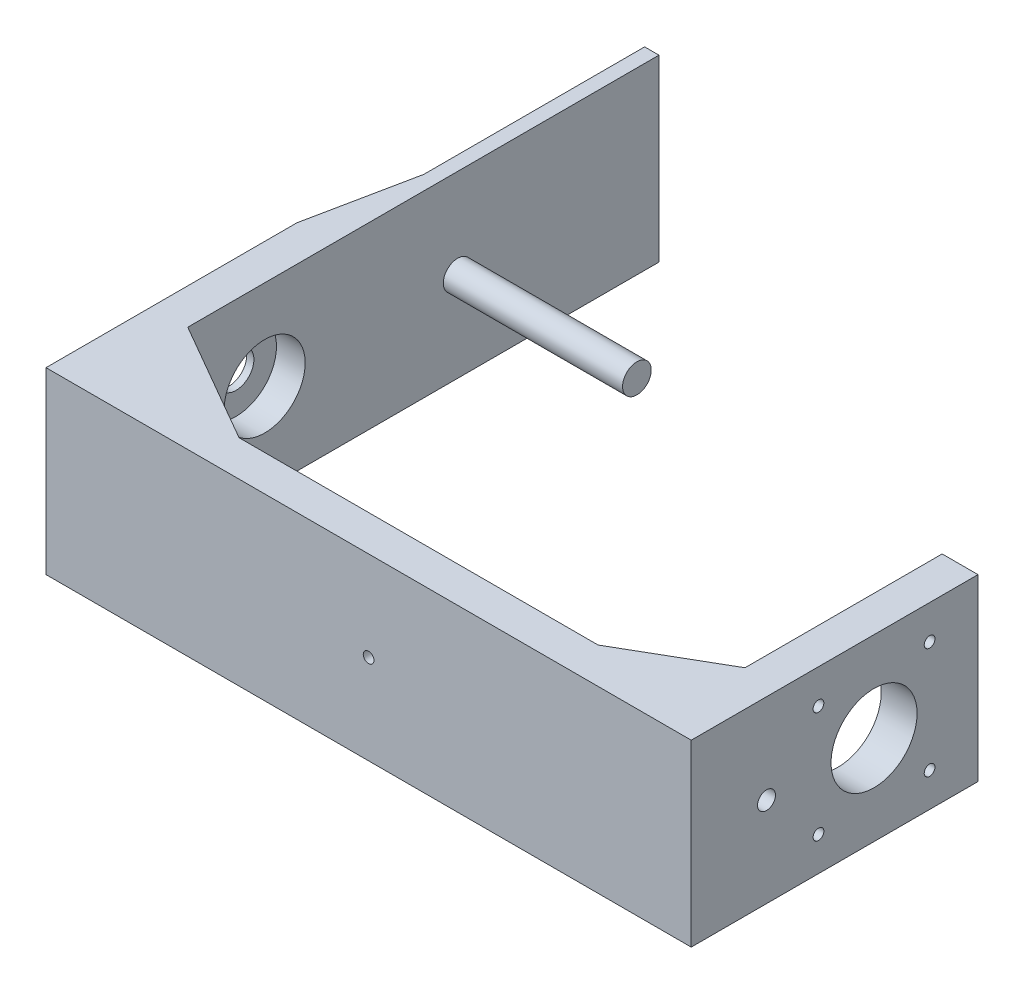
ISO-10303-21;
HEADER;
FILE_DESCRIPTION(('STEP AP214'),'2;1');
FILE_NAME('part.step','',(''),(''),'','','');
FILE_SCHEMA(('AUTOMOTIVE_DESIGN { 1 0 10303 214 1 1 1 1 }'));
ENDSEC;
DATA;
#1=APPLICATION_CONTEXT('core data for automotive mechanical design processes');
#2=APPLICATION_PROTOCOL_DEFINITION('international standard','automotive_design',2000,#1);
#3=PRODUCT_CONTEXT('',#1,'mechanical');
#4=PRODUCT('Part','Part','',(#3));
#5=PRODUCT_RELATED_PRODUCT_CATEGORY('part','',(#4));
#6=PRODUCT_DEFINITION_FORMATION('','',#4);
#7=PRODUCT_DEFINITION_CONTEXT('part definition',#1,'design');
#8=PRODUCT_DEFINITION('design','',#6,#7);
#9=PRODUCT_DEFINITION_SHAPE('','',#8);
#10=(LENGTH_UNIT() NAMED_UNIT(*) SI_UNIT(.MILLI.,.METRE.));
#11=(NAMED_UNIT(*) PLANE_ANGLE_UNIT() SI_UNIT($,.RADIAN.));
#12=(NAMED_UNIT(*) SI_UNIT($,.STERADIAN.) SOLID_ANGLE_UNIT());
#13=UNCERTAINTY_MEASURE_WITH_UNIT(LENGTH_MEASURE(1.E-05),#10,'distance_accuracy_value','');
#14=(GEOMETRIC_REPRESENTATION_CONTEXT(3) GLOBAL_UNCERTAINTY_ASSIGNED_CONTEXT((#13)) GLOBAL_UNIT_ASSIGNED_CONTEXT((#10,
#11,#12)) REPRESENTATION_CONTEXT('',''));
#15=CARTESIAN_POINT('',(0.,0.,0.));
#16=DIRECTION('',(0.,0.,1.));
#17=DIRECTION('',(1.,0.,0.));
#18=AXIS2_PLACEMENT_3D('',#15,#16,#17);
#19=CARTESIAN_POINT('',(-87.9400428265525,50.,-151.));
#20=DIRECTION('',(1.,0.,0.));
#21=DIRECTION('',(0.,0.,-1.));
#22=AXIS2_PLACEMENT_3D('',#19,#20,#21);
#23=PLANE('',#22);
#24=DIRECTION('',(0.,1.,0.));
#25=VECTOR('',#24,1.);
#26=CARTESIAN_POINT('',(-87.9400428265525,0.,-89.393876913398));
#27=LINE('',#26,#25);
#28=CARTESIAN_POINT('',(-87.9400428265525,0.,-89.393876913398));
#29=VERTEX_POINT('',#28);
#30=CARTESIAN_POINT('',(-87.9400428265525,50.,-89.393876913398));
#31=VERTEX_POINT('',#30);
#32=EDGE_CURVE('E171',#29,#31,#27,.T.);
#33=ORIENTED_EDGE('',*,*,#32,.T.);
#34=DIRECTION('',(0.,0.,1.));
#35=VECTOR('',#34,1.);
#36=CARTESIAN_POINT('',(-87.9400428265525,50.,-151.));
#37=LINE('',#36,#35);
#38=CARTESIAN_POINT('',(-87.9400428265525,50.,-151.));
#39=VERTEX_POINT('',#38);
#40=EDGE_CURVE('E364',#39,#31,#37,.T.);
#41=ORIENTED_EDGE('',*,*,#40,.F.);
#42=DIRECTION('',(0.,1.,0.));
#43=VECTOR('',#42,1.);
#44=CARTESIAN_POINT('',(-87.9400428265525,50.,-151.));
#45=LINE('',#44,#43);
#46=CARTESIAN_POINT('',(-87.9400428265525,0.,-151.));
#47=VERTEX_POINT('',#46);
#48=EDGE_CURVE('E362',#47,#39,#45,.T.);
#49=ORIENTED_EDGE('',*,*,#48,.F.);
#50=DIRECTION('',(0.,0.,1.));
#51=VECTOR('',#50,1.);
#52=CARTESIAN_POINT('',(-87.9400428265525,0.,-151.));
#53=LINE('',#52,#51);
#54=EDGE_CURVE('E366',#47,#29,#53,.T.);
#55=ORIENTED_EDGE('',*,*,#54,.T.);
#56=EDGE_LOOP('',(#33,#41,#49,#55));
#57=FACE_BOUND('',#56,.T.);
#58=ADVANCED_FACE('F39',(#57),#23,.F.);
#59=CARTESIAN_POINT('',(-83.9400428265525,50.,0.));
#60=DIRECTION('',(-1.,0.,0.));
#61=DIRECTION('',(0.,0.,1.));
#62=AXIS2_PLACEMENT_3D('',#59,#60,#61);
#63=PLANE('',#62);
#64=CARTESIAN_POINT('',(-83.9400428265525,25.,-94.8407118438723));
#65=DIRECTION('',(-1.,0.,0.));
#66=DIRECTION('',(0.,0.,1.));
#67=AXIS2_PLACEMENT_3D('',#64,#65,#66);
#68=CIRCLE('',#67,4.00466646244737);
#69=CARTESIAN_POINT('',(-83.9400428265525,25.,-90.836045381425));
#70=VERTEX_POINT('',#69);
#71=EDGE_CURVE('E11',#70,#70,#68,.F.);
#72=ORIENTED_EDGE('',*,*,#71,.F.);
#73=EDGE_LOOP('',(#72));
#74=FACE_BOUND('',#73,.T.);
#75=CARTESIAN_POINT('',(-83.9400428265525,25.,-41.));
#76=DIRECTION('',(1.,0.,0.));
#77=DIRECTION('',(0.,0.,-1.));
#78=AXIS2_PLACEMENT_3D('',#75,#76,#77);
#79=CIRCLE('',#78,11.3);
#80=CARTESIAN_POINT('',(-83.9400428265525,25.,-52.3));
#81=VERTEX_POINT('',#80);
#82=EDGE_CURVE('E245',#81,#81,#79,.T.);
#83=ORIENTED_EDGE('',*,*,#82,.F.);
#84=EDGE_LOOP('',(#83));
#85=FACE_BOUND('',#84,.T.);
#86=CARTESIAN_POINT('',(-83.9400428265525,25.,-11.));
#87=DIRECTION('',(1.,0.,0.));
#88=DIRECTION('',(0.,0.,-1.));
#89=AXIS2_PLACEMENT_3D('',#86,#87,#88);
#90=CIRCLE('',#89,2.5);
#91=CARTESIAN_POINT('',(-83.9400428265525,25.,-13.5));
#92=VERTEX_POINT('',#91);
#93=EDGE_CURVE('E377',#92,#92,#90,.T.);
#94=ORIENTED_EDGE('',*,*,#93,.F.);
#95=EDGE_LOOP('',(#94));
#96=FACE_BOUND('',#95,.T.);
#97=DIRECTION('',(0.,0.,1.));
#98=VECTOR('',#97,1.);
#99=CARTESIAN_POINT('',(-83.9400428265525,6.,0.));
#100=LINE('',#99,#98);
#101=CARTESIAN_POINT('',(-83.9400428265525,6.,-19.5495695730572));
#102=VERTEX_POINT('',#101);
#103=CARTESIAN_POINT('',(-83.9400428265525,6.,0.));
#104=VERTEX_POINT('',#103);
#105=EDGE_CURVE('E54',#102,#104,#100,.T.);
#106=ORIENTED_EDGE('',*,*,#105,.F.);
#107=DIRECTION('',(0.,1.,0.));
#108=VECTOR('',#107,1.);
#109=CARTESIAN_POINT('',(-83.9400428265525,50.,-19.5495695730572));
#110=LINE('',#109,#108);
#111=CARTESIAN_POINT('',(-83.9400428265525,0.,-19.5495695730572));
#112=VERTEX_POINT('',#111);
#113=EDGE_CURVE('E239',#102,#112,#110,.F.);
#114=ORIENTED_EDGE('',*,*,#113,.T.);
#115=DIRECTION('',(0.,0.,-1.));
#116=VECTOR('',#115,1.);
#117=CARTESIAN_POINT('',(-83.9400428265525,0.,0.));
#118=LINE('',#117,#116);
#119=CARTESIAN_POINT('',(-83.9400428265525,0.,-151.));
#120=VERTEX_POINT('',#119);
#121=EDGE_CURVE('E192',#112,#120,#118,.T.);
#122=ORIENTED_EDGE('',*,*,#121,.T.);
#123=DIRECTION('',(0.,-1.,0.));
#124=VECTOR('',#123,1.);
#125=CARTESIAN_POINT('',(-83.9400428265525,50.,-151.));
#126=LINE('',#125,#124);
#127=CARTESIAN_POINT('',(-83.9400428265525,50.,-151.));
#128=VERTEX_POINT('',#127);
#129=EDGE_CURVE('E354',#128,#120,#126,.T.);
#130=ORIENTED_EDGE('',*,*,#129,.F.);
#131=DIRECTION('',(0.,0.,-1.));
#132=VECTOR('',#131,1.);
#133=CARTESIAN_POINT('',(-83.9400428265525,50.,0.));
#134=LINE('',#133,#132);
#135=CARTESIAN_POINT('',(-83.9400428265525,50.,-19.5495695730572));
#136=VERTEX_POINT('',#135);
#137=EDGE_CURVE('E207',#136,#128,#134,.T.);
#138=ORIENTED_EDGE('',*,*,#137,.F.);
#139=DIRECTION('',(0.,-1.,0.));
#140=VECTOR('',#139,1.);
#141=CARTESIAN_POINT('',(-83.9400428265525,50.,-19.5495695730572));
#142=LINE('',#141,#140);
#143=CARTESIAN_POINT('',(-83.9400428265525,44.,-19.5495695730572));
#144=VERTEX_POINT('',#143);
#145=EDGE_CURVE('E260',#136,#144,#142,.T.);
#146=ORIENTED_EDGE('',*,*,#145,.T.);
#147=DIRECTION('',(0.,0.,-1.));
#148=VECTOR('',#147,1.);
#149=CARTESIAN_POINT('',(-83.9400428265525,44.,0.));
#150=LINE('',#149,#148);
#151=CARTESIAN_POINT('',(-83.9400428265525,44.,0.));
#152=VERTEX_POINT('',#151);
#153=EDGE_CURVE('E263',#152,#144,#150,.T.);
#154=ORIENTED_EDGE('',*,*,#153,.F.);
#155=DIRECTION('',(0.,-1.,0.));
#156=VECTOR('',#155,1.);
#157=CARTESIAN_POINT('',(-83.9400428265525,50.,0.));
#158=LINE('',#157,#156);
#159=EDGE_CURVE('E208',#152,#104,#158,.T.);
#160=ORIENTED_EDGE('',*,*,#159,.T.);
#161=EDGE_LOOP('',(#106,#114,#122,#130,#138,#146,#154,#160));
#162=FACE_BOUND('',#161,.T.);
#163=ADVANCED_FACE('F41',(#74,#85,#96,#162),#63,.F.);
#164=CARTESIAN_POINT('',(-93.9400428265525,50.,10.));
#165=DIRECTION('',(1.,0.,0.));
#166=DIRECTION('',(0.,0.,-1.));
#167=AXIS2_PLACEMENT_3D('',#164,#165,#166);
#168=PLANE('',#167);
#169=CARTESIAN_POINT('',(-93.9400428265525,25.,-41.));
#170=DIRECTION('',(-1.,0.,0.));
#171=DIRECTION('',(0.,0.,1.));
#172=AXIS2_PLACEMENT_3D('',#169,#170,#171);
#173=CIRCLE('',#172,5.);
#174=CARTESIAN_POINT('',(-93.9400428265525,25.,-36.));
#175=VERTEX_POINT('',#174);
#176=EDGE_CURVE('E378',#175,#175,#173,.T.);
#177=ORIENTED_EDGE('',*,*,#176,.F.);
#178=EDGE_LOOP('',(#177));
#179=FACE_BOUND('',#178,.T.);
#180=CARTESIAN_POINT('',(-93.9400428265525,25.,-11.));
#181=DIRECTION('',(-1.,0.,0.));
#182=DIRECTION('',(0.,0.,1.));
#183=AXIS2_PLACEMENT_3D('',#180,#181,#182);
#184=CIRCLE('',#183,0.75);
#185=CARTESIAN_POINT('',(-93.9400428265525,25.,-10.25));
#186=VERTEX_POINT('',#185);
#187=EDGE_CURVE('E373',#186,#186,#184,.T.);
#188=ORIENTED_EDGE('',*,*,#187,.F.);
#189=EDGE_LOOP('',(#188));
#190=FACE_BOUND('',#189,.T.);
#191=DIRECTION('',(0.,0.,1.));
#192=VECTOR('',#191,1.);
#193=CARTESIAN_POINT('',(-93.9400428265525,0.,10.));
#194=LINE('',#193,#192);
#195=CARTESIAN_POINT('',(-93.9400428265525,0.,-60.));
#196=VERTEX_POINT('',#195);
#197=CARTESIAN_POINT('',(-93.9400428265525,0.,10.));
#198=VERTEX_POINT('',#197);
#199=EDGE_CURVE('E183',#196,#198,#194,.T.);
#200=ORIENTED_EDGE('',*,*,#199,.T.);
#201=DIRECTION('',(0.,-1.,0.));
#202=VECTOR('',#201,1.);
#203=CARTESIAN_POINT('',(-93.9400428265525,50.,10.));
#204=LINE('',#203,#202);
#205=CARTESIAN_POINT('',(-93.9400428265525,50.,10.));
#206=VERTEX_POINT('',#205);
#207=EDGE_CURVE('E187',#206,#198,#204,.T.);
#208=ORIENTED_EDGE('',*,*,#207,.F.);
#209=DIRECTION('',(0.,0.,1.));
#210=VECTOR('',#209,1.);
#211=CARTESIAN_POINT('',(-93.9400428265525,50.,10.));
#212=LINE('',#211,#210);
#213=CARTESIAN_POINT('',(-93.9400428265525,50.,-60.));
#214=VERTEX_POINT('',#213);
#215=EDGE_CURVE('E185',#214,#206,#212,.T.);
#216=ORIENTED_EDGE('',*,*,#215,.F.);
#217=DIRECTION('',(0.,-1.,0.));
#218=VECTOR('',#217,1.);
#219=CARTESIAN_POINT('',(-93.9400428265525,50.,-60.));
#220=LINE('',#219,#218);
#221=EDGE_CURVE('E168',#214,#196,#220,.T.);
#222=ORIENTED_EDGE('',*,*,#221,.T.);
#223=EDGE_LOOP('',(#200,#208,#216,#222));
#224=FACE_BOUND('',#223,.T.);
#225=ADVANCED_FACE('F181',(#179,#190,#224),#168,.F.);
#226=CARTESIAN_POINT('',(-93.9400428265525,50.,10.));
#227=DIRECTION('',(0.,0.,-1.));
#228=DIRECTION('',(-1.,0.,0.));
#229=AXIS2_PLACEMENT_3D('',#226,#227,#228);
#230=PLANE('',#229);
#231=CARTESIAN_POINT('',(-3.94004282655248,25.,10.));
#232=DIRECTION('',(0.,0.,1.));
#233=DIRECTION('',(1.,0.,0.));
#234=AXIS2_PLACEMENT_3D('',#231,#232,#233);
#235=CIRCLE('',#234,1.5);
#236=CARTESIAN_POINT('',(-2.44004282655248,25.,10.));
#237=VERTEX_POINT('',#236);
#238=EDGE_CURVE('E506',#237,#237,#235,.T.);
#239=ORIENTED_EDGE('',*,*,#238,.F.);
#240=EDGE_LOOP('',(#239));
#241=FACE_BOUND('',#240,.T.);
#242=DIRECTION('',(1.,0.,0.));
#243=VECTOR('',#242,1.);
#244=CARTESIAN_POINT('',(-93.9400428265525,0.,10.));
#245=LINE('',#244,#243);
#246=CARTESIAN_POINT('',(86.0599571734475,0.,10.));
#247=VERTEX_POINT('',#246);
#248=EDGE_CURVE('E191',#198,#247,#245,.T.);
#249=ORIENTED_EDGE('',*,*,#248,.T.);
#250=DIRECTION('',(0.,-1.,0.));
#251=VECTOR('',#250,1.);
#252=CARTESIAN_POINT('',(86.0599571734475,50.,10.));
#253=LINE('',#252,#251);
#254=CARTESIAN_POINT('',(86.0599571734475,50.,10.));
#255=VERTEX_POINT('',#254);
#256=EDGE_CURVE('E220',#255,#247,#253,.T.);
#257=ORIENTED_EDGE('',*,*,#256,.F.);
#258=DIRECTION('',(1.,0.,0.));
#259=VECTOR('',#258,1.);
#260=CARTESIAN_POINT('',(-93.9400428265525,50.,10.));
#261=LINE('',#260,#259);
#262=EDGE_CURVE('E328',#206,#255,#261,.T.);
#263=ORIENTED_EDGE('',*,*,#262,.F.);
#264=ORIENTED_EDGE('',*,*,#207,.T.);
#265=EDGE_LOOP('',(#249,#257,#263,#264));
#266=FACE_BOUND('',#265,.T.);
#267=ADVANCED_FACE('F402',(#241,#266),#230,.F.);
#268=CARTESIAN_POINT('',(86.0599571734475,50.,10.));
#269=DIRECTION('',(-1.,0.,0.));
#270=DIRECTION('',(0.,0.,1.));
#271=AXIS2_PLACEMENT_3D('',#268,#269,#270);
#272=PLANE('',#271);
#273=DIRECTION('',(0.,0.,-1.));
#274=VECTOR('',#273,1.);
#275=CARTESIAN_POINT('',(86.0599571734475,0.,10.));
#276=LINE('',#275,#274);
#277=CARTESIAN_POINT('',(86.0599571734475,0.,-70.));
#278=VERTEX_POINT('',#277);
#279=EDGE_CURVE('E194',#247,#278,#276,.T.);
#280=ORIENTED_EDGE('',*,*,#279,.T.);
#281=DIRECTION('',(0.,-1.,0.));
#282=VECTOR('',#281,1.);
#283=CARTESIAN_POINT('',(86.0599571734475,50.,-70.));
#284=LINE('',#283,#282);
#285=CARTESIAN_POINT('',(86.0599571734475,50.,-70.));
#286=VERTEX_POINT('',#285);
#287=EDGE_CURVE('E217',#286,#278,#284,.T.);
#288=ORIENTED_EDGE('',*,*,#287,.F.);
#289=DIRECTION('',(0.,0.,-1.));
#290=VECTOR('',#289,1.);
#291=CARTESIAN_POINT('',(86.0599571734475,50.,10.));
#292=LINE('',#291,#290);
#293=EDGE_CURVE('E330',#255,#286,#292,.T.);
#294=ORIENTED_EDGE('',*,*,#293,.F.);
#295=ORIENTED_EDGE('',*,*,#256,.T.);
#296=EDGE_LOOP('',(#280,#288,#294,#295));
#297=FACE_BOUND('',#296,.T.);
#298=CARTESIAN_POINT('',(86.0599571734475,25.,-11.));
#299=DIRECTION('',(1.,0.,0.));
#300=DIRECTION('',(0.,0.,-1.));
#301=AXIS2_PLACEMENT_3D('',#298,#299,#300);
#302=CIRCLE('',#301,2.5);
#303=CARTESIAN_POINT('',(86.0599571734475,25.,-13.5));
#304=VERTEX_POINT('',#303);
#305=EDGE_CURVE('E294',#304,#304,#302,.T.);
#306=ORIENTED_EDGE('',*,*,#305,.F.);
#307=EDGE_LOOP('',(#306));
#308=FACE_BOUND('',#307,.T.);
#309=CARTESIAN_POINT('',(86.0599571734475,9.50021935639102,-25.5002193563912));
#310=DIRECTION('',(1.,0.,0.));
#311=DIRECTION('',(0.,0.,-1.));
#312=AXIS2_PLACEMENT_3D('',#309,#310,#311);
#313=CIRCLE('',#312,1.5);
#314=CARTESIAN_POINT('',(86.0599571734475,9.50021935639102,-27.0002193563912));
#315=VERTEX_POINT('',#314);
#316=EDGE_CURVE('E291',#315,#315,#313,.T.);
#317=ORIENTED_EDGE('',*,*,#316,.F.);
#318=EDGE_LOOP('',(#317));
#319=FACE_BOUND('',#318,.T.);
#320=CARTESIAN_POINT('',(86.0599571734475,9.50021935639118,-56.4997806436095));
#321=DIRECTION('',(1.,0.,0.));
#322=DIRECTION('',(0.,0.,-1.));
#323=AXIS2_PLACEMENT_3D('',#320,#321,#322);
#324=CIRCLE('',#323,1.5);
#325=CARTESIAN_POINT('',(86.0599571734475,9.50021935639118,-57.9997806436094));
#326=VERTEX_POINT('',#325);
#327=EDGE_CURVE('E301',#326,#326,#324,.T.);
#328=ORIENTED_EDGE('',*,*,#327,.F.);
#329=EDGE_LOOP('',(#328));
#330=FACE_BOUND('',#329,.T.);
#331=CARTESIAN_POINT('',(86.0599571734475,40.4997806436095,-56.4997806436092));
#332=DIRECTION('',(1.,0.,0.));
#333=DIRECTION('',(0.,0.,-1.));
#334=AXIS2_PLACEMENT_3D('',#331,#332,#333);
#335=CIRCLE('',#334,1.49999999999999);
#336=CARTESIAN_POINT('',(86.0599571734475,40.4997806436095,-57.9997806436092));
#337=VERTEX_POINT('',#336);
#338=EDGE_CURVE('E318',#337,#337,#335,.T.);
#339=ORIENTED_EDGE('',*,*,#338,.F.);
#340=EDGE_LOOP('',(#339));
#341=FACE_BOUND('',#340,.T.);
#342=CARTESIAN_POINT('',(86.0599571734475,40.4997806436091,-25.5002193563909));
#343=DIRECTION('',(1.,0.,0.));
#344=DIRECTION('',(0.,0.,-1.));
#345=AXIS2_PLACEMENT_3D('',#342,#343,#344);
#346=CIRCLE('',#345,1.5);
#347=CARTESIAN_POINT('',(86.0599571734475,40.4997806436091,-27.0002193563909));
#348=VERTEX_POINT('',#347);
#349=EDGE_CURVE('E312',#348,#348,#346,.T.);
#350=ORIENTED_EDGE('',*,*,#349,.F.);
#351=EDGE_LOOP('',(#350));
#352=FACE_BOUND('',#351,.T.);
#353=CARTESIAN_POINT('',(86.0599571734475,25.,-41.));
#354=DIRECTION('',(1.,0.,0.));
#355=DIRECTION('',(0.,0.,-1.));
#356=AXIS2_PLACEMENT_3D('',#353,#354,#355);
#357=CIRCLE('',#356,12.);
#358=CARTESIAN_POINT('',(86.0599571734475,25.,-53.));
#359=VERTEX_POINT('',#358);
#360=EDGE_CURVE('E306',#359,#359,#357,.T.);
#361=ORIENTED_EDGE('',*,*,#360,.F.);
#362=EDGE_LOOP('',(#361));
#363=FACE_BOUND('',#362,.T.);
#364=ADVANCED_FACE('F494',(#297,#308,#319,#330,#341,#352,#363),#272,.F.);
#365=CARTESIAN_POINT('',(76.0599571734475,50.,-70.));
#366=DIRECTION('',(0.,0.,1.));
#367=DIRECTION('',(1.,0.,0.));
#368=AXIS2_PLACEMENT_3D('',#365,#366,#367);
#369=PLANE('',#368);
#370=DIRECTION('',(-1.,0.,0.));
#371=VECTOR('',#370,1.);
#372=CARTESIAN_POINT('',(76.0599571734475,0.,-70.));
#373=LINE('',#372,#371);
#374=CARTESIAN_POINT('',(76.0599571734475,0.,-70.));
#375=VERTEX_POINT('',#374);
#376=EDGE_CURVE('E201',#278,#375,#373,.T.);
#377=ORIENTED_EDGE('',*,*,#376,.T.);
#378=DIRECTION('',(0.,-1.,0.));
#379=VECTOR('',#378,1.);
#380=CARTESIAN_POINT('',(76.0599571734475,50.,-70.));
#381=LINE('',#380,#379);
#382=CARTESIAN_POINT('',(76.0599571734475,50.,-70.));
#383=VERTEX_POINT('',#382);
#384=EDGE_CURVE('E214',#383,#375,#381,.T.);
#385=ORIENTED_EDGE('',*,*,#384,.F.);
#386=DIRECTION('',(-1.,0.,0.));
#387=VECTOR('',#386,1.);
#388=CARTESIAN_POINT('',(76.0599571734475,50.,-70.));
#389=LINE('',#388,#387);
#390=EDGE_CURVE('E332',#286,#383,#389,.T.);
#391=ORIENTED_EDGE('',*,*,#390,.F.);
#392=ORIENTED_EDGE('',*,*,#287,.T.);
#393=EDGE_LOOP('',(#377,#385,#391,#392));
#394=FACE_BOUND('',#393,.T.);
#395=ADVANCED_FACE('F490',(#394),#369,.F.);
#396=CARTESIAN_POINT('',(76.0599571734475,50.,0.));
#397=DIRECTION('',(1.,0.,0.));
#398=DIRECTION('',(0.,0.,-1.));
#399=AXIS2_PLACEMENT_3D('',#396,#397,#398);
#400=PLANE('',#399);
#401=CARTESIAN_POINT('',(76.0599571734475,25.,-11.));
#402=DIRECTION('',(1.,0.,0.));
#403=DIRECTION('',(0.,0.,-1.));
#404=AXIS2_PLACEMENT_3D('',#401,#402,#403);
#405=CIRCLE('',#404,2.5);
#406=CARTESIAN_POINT('',(76.0599571734475,25.,-13.5));
#407=VERTEX_POINT('',#406);
#408=EDGE_CURVE('E196',#407,#407,#405,.T.);
#409=ORIENTED_EDGE('',*,*,#408,.T.);
#410=EDGE_LOOP('',(#409));
#411=FACE_BOUND('',#410,.T.);
#412=CARTESIAN_POINT('',(76.0599571734475,9.50021935639102,-25.5002193563912));
#413=DIRECTION('',(1.,0.,0.));
#414=DIRECTION('',(0.,0.,-1.));
#415=AXIS2_PLACEMENT_3D('',#412,#413,#414);
#416=CIRCLE('',#415,1.5);
#417=CARTESIAN_POINT('',(76.0599571734475,9.50021935639102,-27.0002193563912));
#418=VERTEX_POINT('',#417);
#419=EDGE_CURVE('E298',#418,#418,#416,.T.);
#420=ORIENTED_EDGE('',*,*,#419,.T.);
#421=EDGE_LOOP('',(#420));
#422=FACE_BOUND('',#421,.T.);
#423=CARTESIAN_POINT('',(76.0599571734475,9.50021935639118,-56.4997806436095));
#424=DIRECTION('',(1.,0.,0.));
#425=DIRECTION('',(0.,0.,-1.));
#426=AXIS2_PLACEMENT_3D('',#423,#424,#425);
#427=CIRCLE('',#426,1.5);
#428=CARTESIAN_POINT('',(76.0599571734475,9.50021935639118,-57.9997806436094));
#429=VERTEX_POINT('',#428);
#430=EDGE_CURVE('E321',#429,#429,#427,.T.);
#431=ORIENTED_EDGE('',*,*,#430,.T.);
#432=EDGE_LOOP('',(#431));
#433=FACE_BOUND('',#432,.T.);
#434=CARTESIAN_POINT('',(76.0599571734475,40.4997806436095,-56.4997806436092));
#435=DIRECTION('',(1.,0.,0.));
#436=DIRECTION('',(0.,0.,-1.));
#437=AXIS2_PLACEMENT_3D('',#434,#435,#436);
#438=CIRCLE('',#437,1.49999999999999);
#439=CARTESIAN_POINT('',(76.0599571734475,40.4997806436095,-57.9997806436092));
#440=VERTEX_POINT('',#439);
#441=EDGE_CURVE('E315',#440,#440,#438,.T.);
#442=ORIENTED_EDGE('',*,*,#441,.T.);
#443=EDGE_LOOP('',(#442));
#444=FACE_BOUND('',#443,.T.);
#445=CARTESIAN_POINT('',(76.0599571734475,40.4997806436091,-25.5002193563909));
#446=DIRECTION('',(1.,0.,0.));
#447=DIRECTION('',(0.,0.,-1.));
#448=AXIS2_PLACEMENT_3D('',#445,#446,#447);
#449=CIRCLE('',#448,1.5);
#450=CARTESIAN_POINT('',(76.0599571734475,40.4997806436091,-27.0002193563909));
#451=VERTEX_POINT('',#450);
#452=EDGE_CURVE('E309',#451,#451,#449,.T.);
#453=ORIENTED_EDGE('',*,*,#452,.T.);
#454=EDGE_LOOP('',(#453));
#455=FACE_BOUND('',#454,.T.);
#456=CARTESIAN_POINT('',(76.0599571734475,25.,-41.));
#457=DIRECTION('',(1.,0.,0.));
#458=DIRECTION('',(0.,0.,-1.));
#459=AXIS2_PLACEMENT_3D('',#456,#457,#458);
#460=CIRCLE('',#459,12.);
#461=CARTESIAN_POINT('',(76.0599571734475,25.,-53.));
#462=VERTEX_POINT('',#461);
#463=EDGE_CURVE('E297',#462,#462,#460,.T.);
#464=ORIENTED_EDGE('',*,*,#463,.T.);
#465=EDGE_LOOP('',(#464));
#466=FACE_BOUND('',#465,.T.);
#467=DIRECTION('',(0.,0.,1.));
#468=VECTOR('',#467,1.);
#469=CARTESIAN_POINT('',(76.0599571734475,0.,0.));
#470=LINE('',#469,#468);
#471=CARTESIAN_POINT('',(76.0599571734475,0.,-14.9999999999999));
#472=VERTEX_POINT('',#471);
#473=EDGE_CURVE('E203',#375,#472,#470,.T.);
#474=ORIENTED_EDGE('',*,*,#473,.T.);
#475=DIRECTION('',(0.,1.,0.));
#476=VECTOR('',#475,1.);
#477=CARTESIAN_POINT('',(76.0599571734475,50.,-14.9999999999999));
#478=LINE('',#477,#476);
#479=CARTESIAN_POINT('',(76.0599571734475,6.,-14.9999999999999));
#480=VERTEX_POINT('',#479);
#481=EDGE_CURVE('E273',#472,#480,#478,.T.);
#482=ORIENTED_EDGE('',*,*,#481,.T.);
#483=DIRECTION('',(0.,0.,-1.));
#484=VECTOR('',#483,1.);
#485=CARTESIAN_POINT('',(76.0599571734475,6.,0.));
#486=LINE('',#485,#484);
#487=CARTESIAN_POINT('',(76.0599571734475,6.,0.));
#488=VERTEX_POINT('',#487);
#489=EDGE_CURVE('E275',#488,#480,#486,.T.);
#490=ORIENTED_EDGE('',*,*,#489,.F.);
#491=DIRECTION('',(0.,-1.,0.));
#492=VECTOR('',#491,1.);
#493=CARTESIAN_POINT('',(76.0599571734475,50.,0.));
#494=LINE('',#493,#492);
#495=CARTESIAN_POINT('',(76.0599571734475,44.,0.));
#496=VERTEX_POINT('',#495);
#497=EDGE_CURVE('E210',#496,#488,#494,.T.);
#498=ORIENTED_EDGE('',*,*,#497,.F.);
#499=DIRECTION('',(0.,0.,1.));
#500=VECTOR('',#499,1.);
#501=CARTESIAN_POINT('',(76.0599571734475,44.,0.));
#502=LINE('',#501,#500);
#503=CARTESIAN_POINT('',(76.0599571734475,44.,-14.9999999999999));
#504=VERTEX_POINT('',#503);
#505=EDGE_CURVE('E289',#504,#496,#502,.T.);
#506=ORIENTED_EDGE('',*,*,#505,.F.);
#507=DIRECTION('',(0.,-1.,0.));
#508=VECTOR('',#507,1.);
#509=CARTESIAN_POINT('',(76.0599571734475,50.,-14.9999999999999));
#510=LINE('',#509,#508);
#511=CARTESIAN_POINT('',(76.0599571734475,50.,-14.9999999999999));
#512=VERTEX_POINT('',#511);
#513=EDGE_CURVE('E286',#504,#512,#510,.F.);
#514=ORIENTED_EDGE('',*,*,#513,.T.);
#515=DIRECTION('',(0.,0.,1.));
#516=VECTOR('',#515,1.);
#517=CARTESIAN_POINT('',(76.0599571734475,50.,0.));
#518=LINE('',#517,#516);
#519=EDGE_CURVE('E334',#383,#512,#518,.T.);
#520=ORIENTED_EDGE('',*,*,#519,.F.);
#521=ORIENTED_EDGE('',*,*,#384,.T.);
#522=EDGE_LOOP('',(#474,#482,#490,#498,#506,#514,#520,#521));
#523=FACE_BOUND('',#522,.T.);
#524=ADVANCED_FACE('F486',(#411,#422,#433,#444,#455,#466,#523),#400,.F.);
#525=CARTESIAN_POINT('',(-83.9400428265525,50.,0.));
#526=DIRECTION('',(0.,0.,1.));
#527=DIRECTION('',(1.,0.,0.));
#528=AXIS2_PLACEMENT_3D('',#525,#526,#527);
#529=PLANE('',#528);
#530=CARTESIAN_POINT('',(-3.94004282655248,25.,0.));
#531=DIRECTION('',(0.,0.,1.));
#532=DIRECTION('',(1.,0.,0.));
#533=AXIS2_PLACEMENT_3D('',#530,#531,#532);
#534=CIRCLE('',#533,1.5);
#535=CARTESIAN_POINT('',(-2.44004282655248,25.,0.));
#536=VERTEX_POINT('',#535);
#537=EDGE_CURVE('E520',#536,#536,#534,.T.);
#538=ORIENTED_EDGE('',*,*,#537,.T.);
#539=EDGE_LOOP('',(#538));
#540=FACE_BOUND('',#539,.T.);
#541=DIRECTION('',(-1.,0.,0.));
#542=VECTOR('',#541,1.);
#543=CARTESIAN_POINT('',(-83.9400428265525,0.,0.));
#544=LINE('',#543,#542);
#545=CARTESIAN_POINT('',(50.0791950599143,0.,0.));
#546=VERTEX_POINT('',#545);
#547=CARTESIAN_POINT('',(-50.0791950599143,0.,0.));
#548=VERTEX_POINT('',#547);
#549=EDGE_CURVE('E205',#546,#548,#544,.T.);
#550=ORIENTED_EDGE('',*,*,#549,.T.);
#551=DIRECTION('',(0.,-1.,0.));
#552=VECTOR('',#551,1.);
#553=CARTESIAN_POINT('',(-50.0791950599143,50.,0.));
#554=LINE('',#553,#552);
#555=CARTESIAN_POINT('',(-50.0791950599143,6.,0.));
#556=VERTEX_POINT('',#555);
#557=EDGE_CURVE('E62',#548,#556,#554,.F.);
#558=ORIENTED_EDGE('',*,*,#557,.T.);
#559=DIRECTION('',(1.,0.,0.));
#560=VECTOR('',#559,1.);
#561=CARTESIAN_POINT('',(-83.9400428265525,6.,0.));
#562=LINE('',#561,#560);
#563=EDGE_CURVE('E47',#104,#556,#562,.T.);
#564=ORIENTED_EDGE('',*,*,#563,.F.);
#565=ORIENTED_EDGE('',*,*,#159,.F.);
#566=DIRECTION('',(-1.,0.,0.));
#567=VECTOR('',#566,1.);
#568=CARTESIAN_POINT('',(-83.9400428265525,44.,0.));
#569=LINE('',#568,#567);
#570=CARTESIAN_POINT('',(-50.0791950599143,44.,0.));
#571=VERTEX_POINT('',#570);
#572=EDGE_CURVE('E228',#571,#152,#569,.T.);
#573=ORIENTED_EDGE('',*,*,#572,.F.);
#574=DIRECTION('',(0.,1.,0.));
#575=VECTOR('',#574,1.);
#576=CARTESIAN_POINT('',(-50.0791950599143,50.,0.));
#577=LINE('',#576,#575);
#578=CARTESIAN_POINT('',(-50.0791950599143,50.,0.));
#579=VERTEX_POINT('',#578);
#580=EDGE_CURVE('E255',#571,#579,#577,.T.);
#581=ORIENTED_EDGE('',*,*,#580,.T.);
#582=DIRECTION('',(-1.,0.,0.));
#583=VECTOR('',#582,1.);
#584=CARTESIAN_POINT('',(-83.9400428265525,50.,0.));
#585=LINE('',#584,#583);
#586=CARTESIAN_POINT('',(50.0791950599143,50.,0.));
#587=VERTEX_POINT('',#586);
#588=EDGE_CURVE('E211',#587,#579,#585,.T.);
#589=ORIENTED_EDGE('',*,*,#588,.F.);
#590=DIRECTION('',(0.,1.,0.));
#591=VECTOR('',#590,1.);
#592=CARTESIAN_POINT('',(50.0791950599143,50.,0.));
#593=LINE('',#592,#591);
#594=CARTESIAN_POINT('',(50.0791950599143,44.,0.));
#595=VERTEX_POINT('',#594);
#596=EDGE_CURVE('E281',#587,#595,#593,.F.);
#597=ORIENTED_EDGE('',*,*,#596,.T.);
#598=DIRECTION('',(-1.,0.,0.));
#599=VECTOR('',#598,1.);
#600=CARTESIAN_POINT('',(-83.9400428265525,44.,0.));
#601=LINE('',#600,#599);
#602=EDGE_CURVE('E186',#496,#595,#601,.T.);
#603=ORIENTED_EDGE('',*,*,#602,.F.);
#604=ORIENTED_EDGE('',*,*,#497,.T.);
#605=DIRECTION('',(1.,0.,0.));
#606=VECTOR('',#605,1.);
#607=CARTESIAN_POINT('',(-83.9400428265525,6.,0.));
#608=LINE('',#607,#606);
#609=CARTESIAN_POINT('',(50.0791950599143,6.,0.));
#610=VERTEX_POINT('',#609);
#611=EDGE_CURVE('E225',#610,#488,#608,.T.);
#612=ORIENTED_EDGE('',*,*,#611,.F.);
#613=DIRECTION('',(0.,-1.,0.));
#614=VECTOR('',#613,1.);
#615=CARTESIAN_POINT('',(50.0791950599143,50.,0.));
#616=LINE('',#615,#614);
#617=EDGE_CURVE('E269',#610,#546,#616,.T.);
#618=ORIENTED_EDGE('',*,*,#617,.T.);
#619=EDGE_LOOP('',(#550,#558,#564,#565,#573,#581,#589,#597,#603,#604,#612,#618));
#620=FACE_BOUND('',#619,.T.);
#621=ADVANCED_FACE('F342',(#540,#620),#529,.F.);
#622=CARTESIAN_POINT('',(0.,50.,0.));
#623=DIRECTION('',(0.,1.,0.));
#624=DIRECTION('',(0.,0.,1.));
#625=AXIS2_PLACEMENT_3D('',#622,#623,#624);
#626=PLANE('',#625);
#627=DIRECTION('',(0.2,0.,-0.979795897113271));
#628=VECTOR('',#627,1.);
#629=CARTESIAN_POINT('',(-101.93999187885,50.,-20.8084137072202));
#630=LINE('',#629,#628);
#631=EDGE_CURVE('E176',#214,#31,#630,.T.);
#632=ORIENTED_EDGE('',*,*,#631,.F.);
#633=ORIENTED_EDGE('',*,*,#215,.T.);
#634=ORIENTED_EDGE('',*,*,#262,.T.);
#635=ORIENTED_EDGE('',*,*,#293,.T.);
#636=ORIENTED_EDGE('',*,*,#390,.T.);
#637=ORIENTED_EDGE('',*,*,#519,.T.);
#638=DIRECTION('',(0.866025403784442,0.,-0.499999999999995));
#639=VECTOR('',#638,1.);
#640=CARTESIAN_POINT('',(50.0791950599143,50.,0.));
#641=LINE('',#640,#639);
#642=EDGE_CURVE('E279',#587,#512,#641,.T.);
#643=ORIENTED_EDGE('',*,*,#642,.F.);
#644=ORIENTED_EDGE('',*,*,#588,.T.);
#645=DIRECTION('',(-0.866025403784442,0.,-0.499999999999995));
#646=VECTOR('',#645,1.);
#647=CARTESIAN_POINT('',(-50.0791950599143,50.,0.));
#648=LINE('',#647,#646);
#649=EDGE_CURVE('E253',#579,#136,#648,.T.);
#650=ORIENTED_EDGE('',*,*,#649,.T.);
#651=ORIENTED_EDGE('',*,*,#137,.T.);
#652=DIRECTION('',(1.,0.,0.));
#653=VECTOR('',#652,1.);
#654=CARTESIAN_POINT('',(-83.9400428265525,50.,-151.));
#655=LINE('',#654,#653);
#656=EDGE_CURVE('E358',#39,#128,#655,.T.);
#657=ORIENTED_EDGE('',*,*,#656,.F.);
#658=ORIENTED_EDGE('',*,*,#40,.T.);
#659=EDGE_LOOP('',(#632,#633,#634,#635,#636,#637,#643,#644,#650,#651,#657,#658));
#660=FACE_BOUND('',#659,.T.);
#661=ADVANCED_FACE('F339',(#660),#626,.T.);
#662=CARTESIAN_POINT('',(0.,0.,0.));
#663=DIRECTION('',(0.,1.,0.));
#664=DIRECTION('',(0.,0.,1.));
#665=AXIS2_PLACEMENT_3D('',#662,#663,#664);
#666=PLANE('',#665);
#667=ORIENTED_EDGE('',*,*,#199,.F.);
#668=DIRECTION('',(0.2,0.,-0.979795897113271));
#669=VECTOR('',#668,1.);
#670=CARTESIAN_POINT('',(-101.93999187885,0.,-20.8084137072202));
#671=LINE('',#670,#669);
#672=EDGE_CURVE('E165',#196,#29,#671,.T.);
#673=ORIENTED_EDGE('',*,*,#672,.T.);
#674=ORIENTED_EDGE('',*,*,#54,.F.);
#675=DIRECTION('',(-1.,0.,0.));
#676=VECTOR('',#675,1.);
#677=CARTESIAN_POINT('',(-83.9400428265525,0.,-151.));
#678=LINE('',#677,#676);
#679=EDGE_CURVE('E368',#120,#47,#678,.T.);
#680=ORIENTED_EDGE('',*,*,#679,.F.);
#681=ORIENTED_EDGE('',*,*,#121,.F.);
#682=DIRECTION('',(-0.866025403784442,0.,-0.499999999999995));
#683=VECTOR('',#682,1.);
#684=CARTESIAN_POINT('',(-50.0791950599143,0.,0.));
#685=LINE('',#684,#683);
#686=EDGE_CURVE('E240',#548,#112,#685,.T.);
#687=ORIENTED_EDGE('',*,*,#686,.F.);
#688=ORIENTED_EDGE('',*,*,#549,.F.);
#689=DIRECTION('',(0.866025403784442,0.,-0.499999999999995));
#690=VECTOR('',#689,1.);
#691=CARTESIAN_POINT('',(50.0791950599143,0.,0.));
#692=LINE('',#691,#690);
#693=EDGE_CURVE('E266',#546,#472,#692,.T.);
#694=ORIENTED_EDGE('',*,*,#693,.T.);
#695=ORIENTED_EDGE('',*,*,#473,.F.);
#696=ORIENTED_EDGE('',*,*,#376,.F.);
#697=ORIENTED_EDGE('',*,*,#279,.F.);
#698=ORIENTED_EDGE('',*,*,#248,.F.);
#699=EDGE_LOOP('',(#667,#673,#674,#680,#681,#687,#688,#694,#695,#696,#697,#698));
#700=FACE_BOUND('',#699,.T.);
#701=ADVANCED_FACE('F189',(#700),#666,.F.);
#702=CARTESIAN_POINT('',(76.0599571734475,25.,-41.));
#703=DIRECTION('',(1.,0.,0.));
#704=DIRECTION('',(0.,0.,-1.));
#705=AXIS2_PLACEMENT_3D('',#702,#703,#704);
#706=CYLINDRICAL_SURFACE('',#705,12.);
#707=ORIENTED_EDGE('',*,*,#463,.F.);
#708=EDGE_LOOP('',(#707));
#709=FACE_BOUND('',#708,.T.);
#710=ORIENTED_EDGE('',*,*,#360,.T.);
#711=EDGE_LOOP('',(#710));
#712=FACE_BOUND('',#711,.T.);
#713=ADVANCED_FACE('F465',(#709,#712),#706,.F.);
#714=CARTESIAN_POINT('',(76.0599571734475,40.4997806436091,-25.5002193563909));
#715=DIRECTION('',(1.,0.,0.));
#716=DIRECTION('',(0.,0.,-1.));
#717=AXIS2_PLACEMENT_3D('',#714,#715,#716);
#718=CYLINDRICAL_SURFACE('',#717,1.5);
#719=ORIENTED_EDGE('',*,*,#452,.F.);
#720=EDGE_LOOP('',(#719));
#721=FACE_BOUND('',#720,.T.);
#722=ORIENTED_EDGE('',*,*,#349,.T.);
#723=EDGE_LOOP('',(#722));
#724=FACE_BOUND('',#723,.T.);
#725=ADVANCED_FACE('F468',(#721,#724),#718,.F.);
#726=CARTESIAN_POINT('',(76.0599571734475,40.4997806436095,-56.4997806436092));
#727=DIRECTION('',(1.,0.,0.));
#728=DIRECTION('',(0.,0.,-1.));
#729=AXIS2_PLACEMENT_3D('',#726,#727,#728);
#730=CYLINDRICAL_SURFACE('',#729,1.49999999999999);
#731=ORIENTED_EDGE('',*,*,#441,.F.);
#732=EDGE_LOOP('',(#731));
#733=FACE_BOUND('',#732,.T.);
#734=ORIENTED_EDGE('',*,*,#338,.T.);
#735=EDGE_LOOP('',(#734));
#736=FACE_BOUND('',#735,.T.);
#737=ADVANCED_FACE('F472',(#733,#736),#730,.F.);
#738=CARTESIAN_POINT('',(76.0599571734475,9.50021935639118,-56.4997806436095));
#739=DIRECTION('',(1.,0.,0.));
#740=DIRECTION('',(0.,0.,-1.));
#741=AXIS2_PLACEMENT_3D('',#738,#739,#740);
#742=CYLINDRICAL_SURFACE('',#741,1.5);
#743=ORIENTED_EDGE('',*,*,#430,.F.);
#744=EDGE_LOOP('',(#743));
#745=FACE_BOUND('',#744,.T.);
#746=ORIENTED_EDGE('',*,*,#327,.T.);
#747=EDGE_LOOP('',(#746));
#748=FACE_BOUND('',#747,.T.);
#749=ADVANCED_FACE('F463',(#745,#748),#742,.F.);
#750=CARTESIAN_POINT('',(76.0599571734475,9.50021935639102,-25.5002193563912));
#751=DIRECTION('',(1.,0.,0.));
#752=DIRECTION('',(0.,0.,-1.));
#753=AXIS2_PLACEMENT_3D('',#750,#751,#752);
#754=CYLINDRICAL_SURFACE('',#753,1.5);
#755=ORIENTED_EDGE('',*,*,#419,.F.);
#756=EDGE_LOOP('',(#755));
#757=FACE_BOUND('',#756,.T.);
#758=ORIENTED_EDGE('',*,*,#316,.T.);
#759=EDGE_LOOP('',(#758));
#760=FACE_BOUND('',#759,.T.);
#761=ADVANCED_FACE('F459',(#757,#760),#754,.F.);
#762=CARTESIAN_POINT('',(76.0599571734475,25.,-11.));
#763=DIRECTION('',(1.,0.,0.));
#764=DIRECTION('',(0.,0.,-1.));
#765=AXIS2_PLACEMENT_3D('',#762,#763,#764);
#766=CYLINDRICAL_SURFACE('',#765,2.5);
#767=ORIENTED_EDGE('',*,*,#408,.F.);
#768=EDGE_LOOP('',(#767));
#769=FACE_BOUND('',#768,.T.);
#770=ORIENTED_EDGE('',*,*,#305,.T.);
#771=EDGE_LOOP('',(#770));
#772=FACE_BOUND('',#771,.T.);
#773=ADVANCED_FACE('F452',(#769,#772),#766,.F.);
#774=CARTESIAN_POINT('',(-3.94004282655246,44.,-30.));
#775=DIRECTION('',(0.,1.,0.));
#776=DIRECTION('',(0.,0.,1.));
#777=AXIS2_PLACEMENT_3D('',#774,#775,#776);
#778=PLANE('',#777);
#779=DIRECTION('',(0.866025403784442,0.,-0.499999999999995));
#780=VECTOR('',#779,1.);
#781=CARTESIAN_POINT('',(50.0791950599143,44.,0.));
#782=LINE('',#781,#780);
#783=EDGE_CURVE('E278',#595,#504,#782,.T.);
#784=ORIENTED_EDGE('',*,*,#783,.T.);
#785=ORIENTED_EDGE('',*,*,#505,.T.);
#786=ORIENTED_EDGE('',*,*,#602,.T.);
#787=EDGE_LOOP('',(#784,#785,#786));
#788=FACE_BOUND('',#787,.T.);
#789=ADVANCED_FACE('F449',(#788),#778,.F.);
#790=CARTESIAN_POINT('',(50.0791950599143,50.,0.));
#791=DIRECTION('',(0.499999999999995,0.,0.866025403784442));
#792=DIRECTION('',(0.866025403784442,0.,-0.499999999999995));
#793=AXIS2_PLACEMENT_3D('',#790,#791,#792);
#794=PLANE('',#793);
#795=ORIENTED_EDGE('',*,*,#513,.F.);
#796=ORIENTED_EDGE('',*,*,#783,.F.);
#797=ORIENTED_EDGE('',*,*,#596,.F.);
#798=ORIENTED_EDGE('',*,*,#642,.T.);
#799=EDGE_LOOP('',(#795,#796,#797,#798));
#800=FACE_BOUND('',#799,.T.);
#801=ADVANCED_FACE('F444',(#800),#794,.F.);
#802=CARTESIAN_POINT('',(-3.94004282655246,6.,-30.));
#803=DIRECTION('',(0.,-1.,0.));
#804=DIRECTION('',(0.,0.,-1.));
#805=AXIS2_PLACEMENT_3D('',#802,#803,#804);
#806=PLANE('',#805);
#807=ORIENTED_EDGE('',*,*,#611,.T.);
#808=ORIENTED_EDGE('',*,*,#489,.T.);
#809=DIRECTION('',(0.866025403784442,0.,-0.499999999999995));
#810=VECTOR('',#809,1.);
#811=CARTESIAN_POINT('',(50.0791950599143,6.,0.));
#812=LINE('',#811,#810);
#813=EDGE_CURVE('E265',#610,#480,#812,.T.);
#814=ORIENTED_EDGE('',*,*,#813,.F.);
#815=EDGE_LOOP('',(#807,#808,#814));
#816=FACE_BOUND('',#815,.T.);
#817=ADVANCED_FACE('F441',(#816),#806,.F.);
#818=CARTESIAN_POINT('',(50.0791950599143,0.,0.));
#819=DIRECTION('',(-0.499999999999995,0.,-0.866025403784442));
#820=DIRECTION('',(0.866025403784442,0.,-0.499999999999995));
#821=AXIS2_PLACEMENT_3D('',#818,#819,#820);
#822=PLANE('',#821);
#823=ORIENTED_EDGE('',*,*,#481,.F.);
#824=ORIENTED_EDGE('',*,*,#693,.F.);
#825=ORIENTED_EDGE('',*,*,#617,.F.);
#826=ORIENTED_EDGE('',*,*,#813,.T.);
#827=EDGE_LOOP('',(#823,#824,#825,#826));
#828=FACE_BOUND('',#827,.T.);
#829=ADVANCED_FACE('F438',(#828),#822,.T.);
#830=CARTESIAN_POINT('',(-3.94004282655246,44.,-30.));
#831=DIRECTION('',(0.,1.,0.));
#832=DIRECTION('',(0.,0.,1.));
#833=AXIS2_PLACEMENT_3D('',#830,#831,#832);
#834=PLANE('',#833);
#835=ORIENTED_EDGE('',*,*,#572,.T.);
#836=ORIENTED_EDGE('',*,*,#153,.T.);
#837=DIRECTION('',(-0.866025403784442,0.,-0.499999999999995));
#838=VECTOR('',#837,1.);
#839=CARTESIAN_POINT('',(-50.0791950599143,44.,0.));
#840=LINE('',#839,#838);
#841=EDGE_CURVE('E252',#571,#144,#840,.T.);
#842=ORIENTED_EDGE('',*,*,#841,.F.);
#843=EDGE_LOOP('',(#835,#836,#842));
#844=FACE_BOUND('',#843,.T.);
#845=ADVANCED_FACE('F349',(#844),#834,.F.);
#846=CARTESIAN_POINT('',(-50.0791950599143,50.,0.));
#847=DIRECTION('',(0.499999999999995,0.,-0.866025403784442));
#848=DIRECTION('',(-0.866025403784442,0.,-0.499999999999995));
#849=AXIS2_PLACEMENT_3D('',#846,#847,#848);
#850=PLANE('',#849);
#851=ORIENTED_EDGE('',*,*,#145,.F.);
#852=ORIENTED_EDGE('',*,*,#649,.F.);
#853=ORIENTED_EDGE('',*,*,#580,.F.);
#854=ORIENTED_EDGE('',*,*,#841,.T.);
#855=EDGE_LOOP('',(#851,#852,#853,#854));
#856=FACE_BOUND('',#855,.T.);
#857=ADVANCED_FACE('F347',(#856),#850,.T.);
#858=CARTESIAN_POINT('',(-3.94004282655246,6.,-30.));
#859=DIRECTION('',(0.,-1.,0.));
#860=DIRECTION('',(0.,0.,-1.));
#861=AXIS2_PLACEMENT_3D('',#858,#859,#860);
#862=PLANE('',#861);
#863=DIRECTION('',(-0.866025403784442,0.,-0.499999999999995));
#864=VECTOR('',#863,1.);
#865=CARTESIAN_POINT('',(-50.0791950599143,6.,0.));
#866=LINE('',#865,#864);
#867=EDGE_CURVE('E233',#556,#102,#866,.T.);
#868=ORIENTED_EDGE('',*,*,#867,.T.);
#869=ORIENTED_EDGE('',*,*,#105,.T.);
#870=ORIENTED_EDGE('',*,*,#563,.T.);
#871=EDGE_LOOP('',(#868,#869,#870));
#872=FACE_BOUND('',#871,.T.);
#873=ADVANCED_FACE('F232',(#872),#862,.F.);
#874=CARTESIAN_POINT('',(-50.0791950599143,0.,0.));
#875=DIRECTION('',(-0.499999999999995,0.,0.866025403784442));
#876=DIRECTION('',(-0.866025403784442,0.,-0.499999999999995));
#877=AXIS2_PLACEMENT_3D('',#874,#875,#876);
#878=PLANE('',#877);
#879=ORIENTED_EDGE('',*,*,#113,.F.);
#880=ORIENTED_EDGE('',*,*,#867,.F.);
#881=ORIENTED_EDGE('',*,*,#557,.F.);
#882=ORIENTED_EDGE('',*,*,#686,.T.);
#883=EDGE_LOOP('',(#879,#880,#881,#882));
#884=FACE_BOUND('',#883,.T.);
#885=ADVANCED_FACE('F236',(#884),#878,.F.);
#886=CARTESIAN_POINT('',(-91.9400428265525,25.,-11.));
#887=DIRECTION('',(1.,0.,0.));
#888=DIRECTION('',(0.,0.,-1.));
#889=AXIS2_PLACEMENT_3D('',#886,#887,#888);
#890=CYLINDRICAL_SURFACE('',#889,2.5);
#891=CARTESIAN_POINT('',(-91.9400428265525,25.,-11.));
#892=DIRECTION('',(1.,0.,0.));
#893=DIRECTION('',(0.,0.,-1.));
#894=AXIS2_PLACEMENT_3D('',#891,#892,#893);
#895=CIRCLE('',#894,2.5);
#896=CARTESIAN_POINT('',(-91.9400428265525,25.,-13.5));
#897=VERTEX_POINT('',#896);
#898=EDGE_CURVE('E388',#897,#897,#895,.T.);
#899=ORIENTED_EDGE('',*,*,#898,.F.);
#900=EDGE_LOOP('',(#899));
#901=FACE_BOUND('',#900,.T.);
#902=ORIENTED_EDGE('',*,*,#93,.T.);
#903=EDGE_LOOP('',(#902));
#904=FACE_BOUND('',#903,.T.);
#905=ADVANCED_FACE('F393',(#901,#904),#890,.F.);
#906=CARTESIAN_POINT('',(-91.9400428265525,25.,-11.));
#907=DIRECTION('',(1.,0.,0.));
#908=DIRECTION('',(0.,0.,-1.));
#909=AXIS2_PLACEMENT_3D('',#906,#907,#908);
#910=PLANE('',#909);
#911=CARTESIAN_POINT('',(-91.9400428265525,25.,-11.));
#912=DIRECTION('',(-1.,0.,0.));
#913=DIRECTION('',(0.,0.,1.));
#914=AXIS2_PLACEMENT_3D('',#911,#912,#913);
#915=CIRCLE('',#914,0.75);
#916=CARTESIAN_POINT('',(-91.9400428265525,25.,-10.25));
#917=VERTEX_POINT('',#916);
#918=EDGE_CURVE('E381',#917,#917,#915,.T.);
#919=ORIENTED_EDGE('',*,*,#918,.T.);
#920=EDGE_LOOP('',(#919));
#921=FACE_BOUND('',#920,.T.);
#922=ORIENTED_EDGE('',*,*,#898,.T.);
#923=EDGE_LOOP('',(#922));
#924=FACE_BOUND('',#923,.T.);
#925=ADVANCED_FACE('F414',(#921,#924),#910,.T.);
#926=CARTESIAN_POINT('',(-91.9400428265525,25.,-41.));
#927=DIRECTION('',(1.,0.,0.));
#928=DIRECTION('',(0.,0.,-1.));
#929=AXIS2_PLACEMENT_3D('',#926,#927,#928);
#930=CYLINDRICAL_SURFACE('',#929,11.3);
#931=CARTESIAN_POINT('',(-91.9400428265525,25.,-41.));
#932=DIRECTION('',(1.,0.,0.));
#933=DIRECTION('',(0.,0.,-1.));
#934=AXIS2_PLACEMENT_3D('',#931,#932,#933);
#935=CIRCLE('',#934,11.3);
#936=CARTESIAN_POINT('',(-91.9400428265525,25.,-52.3));
#937=VERTEX_POINT('',#936);
#938=EDGE_CURVE('E241',#937,#937,#935,.T.);
#939=ORIENTED_EDGE('',*,*,#938,.F.);
#940=EDGE_LOOP('',(#939));
#941=FACE_BOUND('',#940,.T.);
#942=ORIENTED_EDGE('',*,*,#82,.T.);
#943=EDGE_LOOP('',(#942));
#944=FACE_BOUND('',#943,.T.);
#945=ADVANCED_FACE('F411',(#941,#944),#930,.F.);
#946=CARTESIAN_POINT('',(-91.9400428265525,25.,-41.));
#947=DIRECTION('',(1.,0.,0.));
#948=DIRECTION('',(0.,0.,-1.));
#949=AXIS2_PLACEMENT_3D('',#946,#947,#948);
#950=PLANE('',#949);
#951=CARTESIAN_POINT('',(-91.9400428265525,25.,-41.));
#952=DIRECTION('',(-1.,0.,0.));
#953=DIRECTION('',(0.,0.,1.));
#954=AXIS2_PLACEMENT_3D('',#951,#952,#953);
#955=CIRCLE('',#954,5.);
#956=CARTESIAN_POINT('',(-91.9400428265525,25.,-36.));
#957=VERTEX_POINT('',#956);
#958=EDGE_CURVE('E374',#957,#957,#955,.T.);
#959=ORIENTED_EDGE('',*,*,#958,.T.);
#960=EDGE_LOOP('',(#959));
#961=FACE_BOUND('',#960,.T.);
#962=ORIENTED_EDGE('',*,*,#938,.T.);
#963=EDGE_LOOP('',(#962));
#964=FACE_BOUND('',#963,.T.);
#965=ADVANCED_FACE('F413',(#961,#964),#950,.T.);
#966=CARTESIAN_POINT('',(-91.9400428265525,25.,-11.));
#967=DIRECTION('',(-1.,0.,0.));
#968=DIRECTION('',(0.,0.,1.));
#969=AXIS2_PLACEMENT_3D('',#966,#967,#968);
#970=CYLINDRICAL_SURFACE('',#969,0.75);
#971=ORIENTED_EDGE('',*,*,#918,.F.);
#972=EDGE_LOOP('',(#971));
#973=FACE_BOUND('',#972,.T.);
#974=ORIENTED_EDGE('',*,*,#187,.T.);
#975=EDGE_LOOP('',(#974));
#976=FACE_BOUND('',#975,.T.);
#977=ADVANCED_FACE('F421',(#973,#976),#970,.F.);
#978=CARTESIAN_POINT('',(-91.9400428265525,25.,-41.));
#979=DIRECTION('',(-1.,0.,0.));
#980=DIRECTION('',(0.,0.,1.));
#981=AXIS2_PLACEMENT_3D('',#978,#979,#980);
#982=CYLINDRICAL_SURFACE('',#981,5.);
#983=ORIENTED_EDGE('',*,*,#958,.F.);
#984=EDGE_LOOP('',(#983));
#985=FACE_BOUND('',#984,.T.);
#986=ORIENTED_EDGE('',*,*,#176,.T.);
#987=EDGE_LOOP('',(#986));
#988=FACE_BOUND('',#987,.T.);
#989=ADVANCED_FACE('F556',(#985,#988),#982,.F.);
#990=CARTESIAN_POINT('',(0.,0.,-151.));
#991=DIRECTION('',(0.,0.,-1.));
#992=DIRECTION('',(-1.,0.,0.));
#993=AXIS2_PLACEMENT_3D('',#990,#991,#992);
#994=PLANE('',#993);
#995=ORIENTED_EDGE('',*,*,#129,.T.);
#996=ORIENTED_EDGE('',*,*,#679,.T.);
#997=ORIENTED_EDGE('',*,*,#48,.T.);
#998=ORIENTED_EDGE('',*,*,#656,.T.);
#999=EDGE_LOOP('',(#995,#996,#997,#998));
#1000=FACE_BOUND('',#999,.T.);
#1001=ADVANCED_FACE('F360',(#1000),#994,.T.);
#1002=CARTESIAN_POINT('',(-101.93999187885,0.,-20.8084137072202));
#1003=DIRECTION('',(0.979795897113271,0.,0.2));
#1004=DIRECTION('',(0.2,0.,-0.979795897113271));
#1005=AXIS2_PLACEMENT_3D('',#1002,#1003,#1004);
#1006=PLANE('',#1005);
#1007=ORIENTED_EDGE('',*,*,#631,.T.);
#1008=ORIENTED_EDGE('',*,*,#32,.F.);
#1009=ORIENTED_EDGE('',*,*,#672,.F.);
#1010=ORIENTED_EDGE('',*,*,#221,.F.);
#1011=EDGE_LOOP('',(#1007,#1008,#1009,#1010));
#1012=FACE_BOUND('',#1011,.T.);
#1013=ADVANCED_FACE('F167',(#1012),#1006,.F.);
#1014=CARTESIAN_POINT('',(-3.94004282655248,25.,0.));
#1015=DIRECTION('',(0.,0.,1.));
#1016=DIRECTION('',(1.,0.,0.));
#1017=AXIS2_PLACEMENT_3D('',#1014,#1015,#1016);
#1018=CYLINDRICAL_SURFACE('',#1017,1.5);
#1019=ORIENTED_EDGE('',*,*,#537,.F.);
#1020=EDGE_LOOP('',(#1019));
#1021=FACE_BOUND('',#1020,.T.);
#1022=ORIENTED_EDGE('',*,*,#238,.T.);
#1023=EDGE_LOOP('',(#1022));
#1024=FACE_BOUND('',#1023,.T.);
#1025=ADVANCED_FACE('F544',(#1021,#1024),#1018,.F.);
#1026=CARTESIAN_POINT('',(-33.9400428265525,25.,-94.8407118438723));
#1027=DIRECTION('',(-1.,0.,0.));
#1028=DIRECTION('',(0.,0.,1.));
#1029=AXIS2_PLACEMENT_3D('',#1026,#1027,#1028);
#1030=CYLINDRICAL_SURFACE('',#1029,4.00466646244737);
#1031=CARTESIAN_POINT('',(-33.9400428265525,25.,-94.8407118438723));
#1032=DIRECTION('',(1.,0.,0.));
#1033=DIRECTION('',(0.,0.,-1.));
#1034=AXIS2_PLACEMENT_3D('',#1031,#1032,#1033);
#1035=CIRCLE('',#1034,4.00466646244737);
#1036=CARTESIAN_POINT('',(-33.9400428265525,25.,-98.8453783063197));
#1037=VERTEX_POINT('',#1036);
#1038=EDGE_CURVE('E534',#1037,#1037,#1035,.T.);
#1039=ORIENTED_EDGE('',*,*,#1038,.F.);
#1040=EDGE_LOOP('',(#1039));
#1041=FACE_BOUND('',#1040,.T.);
#1042=ORIENTED_EDGE('',*,*,#71,.T.);
#1043=EDGE_LOOP('',(#1042));
#1044=FACE_BOUND('',#1043,.T.);
#1045=ADVANCED_FACE('F541',(#1041,#1044),#1030,.T.);
#1046=CARTESIAN_POINT('',(-33.9400428265525,25.,-94.8407118438723));
#1047=DIRECTION('',(1.,0.,0.));
#1048=DIRECTION('',(0.,0.,-1.));
#1049=AXIS2_PLACEMENT_3D('',#1046,#1047,#1048);
#1050=PLANE('',#1049);
#1051=ORIENTED_EDGE('',*,*,#1038,.T.);
#1052=EDGE_LOOP('',(#1051));
#1053=FACE_BOUND('',#1052,.T.);
#1054=ADVANCED_FACE('F539',(#1053),#1050,.T.);
#1055=CLOSED_SHELL('',(#58,#163,#225,#267,#364,#395,#524,#621,#661,#701,#713,#725,#737,#749,
#761,#773,#789,#801,#817,#829,#845,#857,#873,#885,#905,#925,#945,#965,#977,#989,#1001,#1013,
#1025,#1045,#1054));
#1056=MANIFOLD_SOLID_BREP('B2',#1055);
#1057=ADVANCED_BREP_SHAPE_REPRESENTATION('',(#18,#1056),#14);
#1058=SHAPE_DEFINITION_REPRESENTATION(#9,#1057);
ENDSEC;
END-ISO-10303-21;
